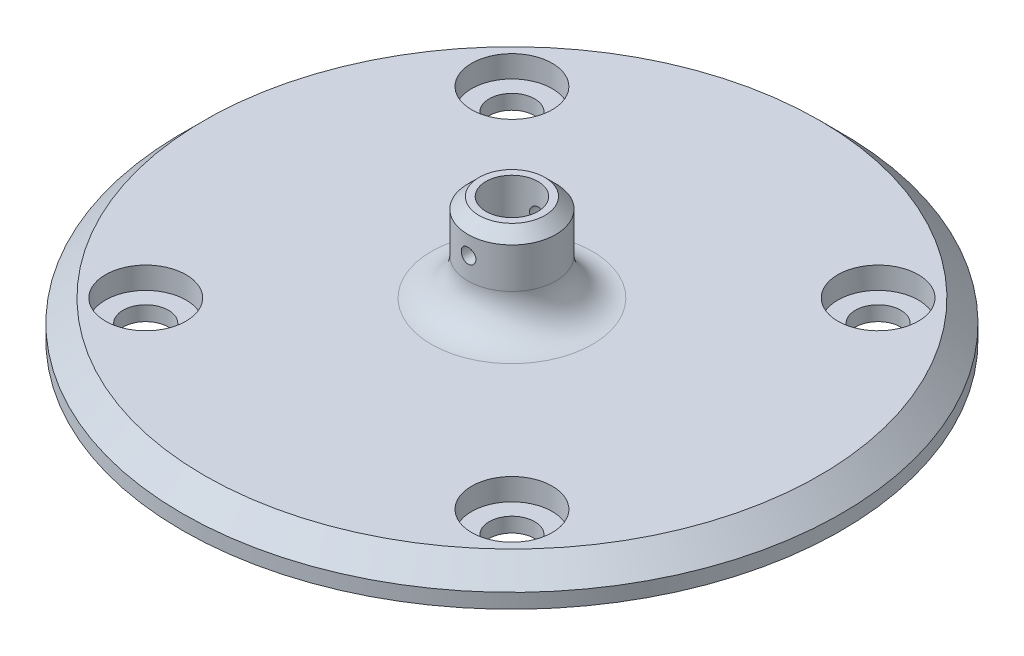
ISO-10303-21;
HEADER;
FILE_DESCRIPTION(('STEP AP214'),'2;1');
FILE_NAME('part.step','',(''),(''),'','','');
FILE_SCHEMA(('AUTOMOTIVE_DESIGN { 1 0 10303 214 1 1 1 1 }'));
ENDSEC;
DATA;
#1=APPLICATION_CONTEXT('core data for automotive mechanical design processes');
#2=APPLICATION_PROTOCOL_DEFINITION('international standard','automotive_design',2000,#1);
#3=PRODUCT_CONTEXT('',#1,'mechanical');
#4=PRODUCT('Part','Part','',(#3));
#5=PRODUCT_RELATED_PRODUCT_CATEGORY('part','',(#4));
#6=PRODUCT_DEFINITION_FORMATION('','',#4);
#7=PRODUCT_DEFINITION_CONTEXT('part definition',#1,'design');
#8=PRODUCT_DEFINITION('design','',#6,#7);
#9=PRODUCT_DEFINITION_SHAPE('','',#8);
#10=(LENGTH_UNIT() NAMED_UNIT(*) SI_UNIT(.MILLI.,.METRE.));
#11=(NAMED_UNIT(*) PLANE_ANGLE_UNIT() SI_UNIT($,.RADIAN.));
#12=(NAMED_UNIT(*) SI_UNIT($,.STERADIAN.) SOLID_ANGLE_UNIT());
#13=UNCERTAINTY_MEASURE_WITH_UNIT(LENGTH_MEASURE(1.E-05),#10,'distance_accuracy_value','');
#14=(GEOMETRIC_REPRESENTATION_CONTEXT(3) GLOBAL_UNCERTAINTY_ASSIGNED_CONTEXT((#13)) GLOBAL_UNIT_ASSIGNED_CONTEXT((#10,
#11,#12)) REPRESENTATION_CONTEXT('',''));
#15=CARTESIAN_POINT('',(0.,0.,0.));
#16=DIRECTION('',(0.,0.,1.));
#17=DIRECTION('',(1.,0.,0.));
#18=AXIS2_PLACEMENT_3D('',#15,#16,#17);
#19=CARTESIAN_POINT('',(-25.0000000000003,0.,24.9999999999997));
#20=DIRECTION('',(0.,1.,0.));
#21=DIRECTION('',(0.,0.,1.));
#22=AXIS2_PLACEMENT_3D('',#19,#20,#21);
#23=CYLINDRICAL_SURFACE('',#22,3.1);
#24=CARTESIAN_POINT('',(-25.0000000000003,0.,24.9999999999997));
#25=DIRECTION('',(0.,1.,0.));
#26=DIRECTION('',(1.,0.,0.));
#27=AXIS2_PLACEMENT_3D('',#24,#25,#26);
#28=CIRCLE('',#27,3.1);
#29=CARTESIAN_POINT('',(-21.9000000000003,0.,24.9999999999998));
#30=VERTEX_POINT('',#29);
#31=EDGE_CURVE('E220',#30,#30,#28,.T.);
#32=ORIENTED_EDGE('',*,*,#31,.F.);
#33=EDGE_LOOP('',(#32));
#34=FACE_BOUND('',#33,.T.);
#35=CARTESIAN_POINT('',(-25.0000000000003,2.,24.9999999999997));
#36=DIRECTION('',(0.,1.,0.));
#37=DIRECTION('',(0.,0.,1.));
#38=AXIS2_PLACEMENT_3D('',#35,#36,#37);
#39=CIRCLE('',#38,3.1);
#40=CARTESIAN_POINT('',(-25.0000000000003,2.,28.0999999999997));
#41=VERTEX_POINT('',#40);
#42=EDGE_CURVE('E239',#41,#41,#39,.F.);
#43=ORIENTED_EDGE('',*,*,#42,.F.);
#44=EDGE_LOOP('',(#43));
#45=FACE_BOUND('',#44,.T.);
#46=ADVANCED_FACE('F45',(#34,#45),#23,.F.);
#47=CARTESIAN_POINT('',(25.,0.,25.));
#48=DIRECTION('',(0.,1.,0.));
#49=DIRECTION('',(0.,0.,1.));
#50=AXIS2_PLACEMENT_3D('',#47,#48,#49);
#51=CYLINDRICAL_SURFACE('',#50,3.1);
#52=CARTESIAN_POINT('',(25.,0.,25.));
#53=DIRECTION('',(0.,1.,0.));
#54=DIRECTION('',(0.,0.,-1.));
#55=AXIS2_PLACEMENT_3D('',#52,#53,#54);
#56=CIRCLE('',#55,3.1);
#57=CARTESIAN_POINT('',(25.,0.,21.9));
#58=VERTEX_POINT('',#57);
#59=EDGE_CURVE('E217',#58,#58,#56,.T.);
#60=ORIENTED_EDGE('',*,*,#59,.F.);
#61=EDGE_LOOP('',(#60));
#62=FACE_BOUND('',#61,.T.);
#63=CARTESIAN_POINT('',(25.,2.,25.));
#64=DIRECTION('',(0.,1.,0.));
#65=DIRECTION('',(0.,0.,1.));
#66=AXIS2_PLACEMENT_3D('',#63,#64,#65);
#67=CIRCLE('',#66,3.1);
#68=CARTESIAN_POINT('',(25.,2.,28.1));
#69=VERTEX_POINT('',#68);
#70=EDGE_CURVE('E235',#69,#69,#67,.F.);
#71=ORIENTED_EDGE('',*,*,#70,.F.);
#72=EDGE_LOOP('',(#71));
#73=FACE_BOUND('',#72,.T.);
#74=ADVANCED_FACE('F143',(#62,#73),#51,.F.);
#75=CARTESIAN_POINT('',(25.0000000000001,0.,-24.9999999999999));
#76=DIRECTION('',(0.,1.,0.));
#77=DIRECTION('',(0.,0.,1.));
#78=AXIS2_PLACEMENT_3D('',#75,#76,#77);
#79=CYLINDRICAL_SURFACE('',#78,3.1);
#80=CARTESIAN_POINT('',(25.0000000000001,0.,-24.9999999999999));
#81=DIRECTION('',(0.,1.,0.));
#82=DIRECTION('',(-1.,0.,0.));
#83=AXIS2_PLACEMENT_3D('',#80,#81,#82);
#84=CIRCLE('',#83,3.1);
#85=CARTESIAN_POINT('',(21.9000000000001,0.,-24.9999999999999));
#86=VERTEX_POINT('',#85);
#87=EDGE_CURVE('E211',#86,#86,#84,.T.);
#88=ORIENTED_EDGE('',*,*,#87,.F.);
#89=EDGE_LOOP('',(#88));
#90=FACE_BOUND('',#89,.T.);
#91=CARTESIAN_POINT('',(25.0000000000001,2.,-24.9999999999999));
#92=DIRECTION('',(0.,1.,0.));
#93=DIRECTION('',(0.,0.,1.));
#94=AXIS2_PLACEMENT_3D('',#91,#92,#93);
#95=CIRCLE('',#94,3.1);
#96=CARTESIAN_POINT('',(25.0000000000001,2.,-21.8999999999999));
#97=VERTEX_POINT('',#96);
#98=EDGE_CURVE('E232',#97,#97,#95,.F.);
#99=ORIENTED_EDGE('',*,*,#98,.F.);
#100=EDGE_LOOP('',(#99));
#101=FACE_BOUND('',#100,.T.);
#102=ADVANCED_FACE('F139',(#90,#101),#79,.F.);
#103=CARTESIAN_POINT('',(-25.,0.,-25.));
#104=DIRECTION('',(0.,1.,0.));
#105=DIRECTION('',(0.,0.,1.));
#106=AXIS2_PLACEMENT_3D('',#103,#104,#105);
#107=CYLINDRICAL_SURFACE('',#106,3.1);
#108=CARTESIAN_POINT('',(-25.,0.,-25.));
#109=DIRECTION('',(0.,1.,0.));
#110=DIRECTION('',(0.,0.,1.));
#111=AXIS2_PLACEMENT_3D('',#108,#109,#110);
#112=CIRCLE('',#111,3.1);
#113=CARTESIAN_POINT('',(-25.,0.,-21.9));
#114=VERTEX_POINT('',#113);
#115=EDGE_CURVE('E223',#114,#114,#112,.T.);
#116=ORIENTED_EDGE('',*,*,#115,.F.);
#117=EDGE_LOOP('',(#116));
#118=FACE_BOUND('',#117,.T.);
#119=CARTESIAN_POINT('',(-25.,2.,-25.));
#120=DIRECTION('',(0.,1.,0.));
#121=DIRECTION('',(0.,0.,1.));
#122=AXIS2_PLACEMENT_3D('',#119,#120,#121);
#123=CIRCLE('',#122,3.1);
#124=CARTESIAN_POINT('',(-25.,2.,-21.9));
#125=VERTEX_POINT('',#124);
#126=EDGE_CURVE('E214',#125,#125,#123,.F.);
#127=ORIENTED_EDGE('',*,*,#126,.F.);
#128=EDGE_LOOP('',(#127));
#129=FACE_BOUND('',#128,.T.);
#130=ADVANCED_FACE('F142',(#118,#129),#107,.F.);
#131=CARTESIAN_POINT('',(0.,5.,0.));
#132=DIRECTION('',(0.,-1.,0.));
#133=DIRECTION('',(0.,0.,-1.));
#134=AXIS2_PLACEMENT_3D('',#131,#132,#133);
#135=CYLINDRICAL_SURFACE('',#134,45.);
#136=CARTESIAN_POINT('',(0.,2.00000000000001,0.));
#137=DIRECTION('',(0.,1.,0.));
#138=DIRECTION('',(0.,0.,1.));
#139=AXIS2_PLACEMENT_3D('',#136,#137,#138);
#140=CIRCLE('',#139,45.);
#141=CARTESIAN_POINT('',(0.,2.00000000000001,45.));
#142=VERTEX_POINT('',#141);
#143=EDGE_CURVE('E57',#142,#142,#140,.F.);
#144=ORIENTED_EDGE('',*,*,#143,.T.);
#145=EDGE_LOOP('',(#144));
#146=FACE_BOUND('',#145,.T.);
#147=CARTESIAN_POINT('',(0.,0.,0.));
#148=DIRECTION('',(0.,1.,0.));
#149=DIRECTION('',(0.,0.,1.));
#150=AXIS2_PLACEMENT_3D('',#147,#148,#149);
#151=CIRCLE('',#150,45.);
#152=CARTESIAN_POINT('',(0.,0.,45.));
#153=VERTEX_POINT('',#152);
#154=EDGE_CURVE('E226',#153,#153,#151,.T.);
#155=ORIENTED_EDGE('',*,*,#154,.T.);
#156=EDGE_LOOP('',(#155));
#157=FACE_BOUND('',#156,.T.);
#158=ADVANCED_FACE('F161',(#146,#157),#135,.T.);
#159=CARTESIAN_POINT('',(0.,5.,0.));
#160=DIRECTION('',(0.,1.,0.));
#161=DIRECTION('',(0.,0.,1.));
#162=AXIS2_PLACEMENT_3D('',#159,#160,#161);
#163=PLANE('',#162);
#164=CARTESIAN_POINT('',(0.,5.,0.));
#165=DIRECTION('',(0.,1.,0.));
#166=DIRECTION('',(0.,0.,1.));
#167=AXIS2_PLACEMENT_3D('',#164,#165,#166);
#168=CIRCLE('',#167,42.);
#169=CARTESIAN_POINT('',(0.,5.,42.));
#170=VERTEX_POINT('',#169);
#171=EDGE_CURVE('E61',#170,#170,#168,.T.);
#172=ORIENTED_EDGE('',*,*,#171,.T.);
#173=EDGE_LOOP('',(#172));
#174=FACE_BOUND('',#173,.T.);
#175=CARTESIAN_POINT('',(0.,5.,0.));
#176=DIRECTION('',(0.,1.,0.));
#177=DIRECTION('',(0.,0.,1.));
#178=AXIS2_PLACEMENT_3D('',#175,#176,#177);
#179=CIRCLE('',#178,11.);
#180=CARTESIAN_POINT('',(0.,5.,11.));
#181=VERTEX_POINT('',#180);
#182=EDGE_CURVE('E66',#181,#181,#179,.F.);
#183=ORIENTED_EDGE('',*,*,#182,.T.);
#184=EDGE_LOOP('',(#183));
#185=FACE_BOUND('',#184,.T.);
#186=CARTESIAN_POINT('',(25.0000000000001,5.,-24.9999999999999));
#187=DIRECTION('',(0.,1.,0.));
#188=DIRECTION('',(-1.,0.,0.));
#189=AXIS2_PLACEMENT_3D('',#186,#187,#188);
#190=CIRCLE('',#189,5.5);
#191=CARTESIAN_POINT('',(19.5000000000001,5.,-24.9999999999999));
#192=VERTEX_POINT('',#191);
#193=EDGE_CURVE('E197',#192,#192,#190,.T.);
#194=ORIENTED_EDGE('',*,*,#193,.F.);
#195=EDGE_LOOP('',(#194));
#196=FACE_BOUND('',#195,.T.);
#197=CARTESIAN_POINT('',(25.,5.,25.));
#198=DIRECTION('',(0.,1.,0.));
#199=DIRECTION('',(0.,0.,-1.));
#200=AXIS2_PLACEMENT_3D('',#197,#198,#199);
#201=CIRCLE('',#200,5.5);
#202=CARTESIAN_POINT('',(25.,5.,19.5));
#203=VERTEX_POINT('',#202);
#204=EDGE_CURVE('E201',#203,#203,#201,.T.);
#205=ORIENTED_EDGE('',*,*,#204,.F.);
#206=EDGE_LOOP('',(#205));
#207=FACE_BOUND('',#206,.T.);
#208=CARTESIAN_POINT('',(-25.0000000000003,5.,24.9999999999997));
#209=DIRECTION('',(0.,1.,0.));
#210=DIRECTION('',(1.,0.,0.));
#211=AXIS2_PLACEMENT_3D('',#208,#209,#210);
#212=CIRCLE('',#211,5.5);
#213=CARTESIAN_POINT('',(-19.5000000000003,5.,24.9999999999998));
#214=VERTEX_POINT('',#213);
#215=EDGE_CURVE('E205',#214,#214,#212,.T.);
#216=ORIENTED_EDGE('',*,*,#215,.F.);
#217=EDGE_LOOP('',(#216));
#218=FACE_BOUND('',#217,.T.);
#219=CARTESIAN_POINT('',(-25.,5.,-25.));
#220=DIRECTION('',(0.,1.,0.));
#221=DIRECTION('',(0.,0.,1.));
#222=AXIS2_PLACEMENT_3D('',#219,#220,#221);
#223=CIRCLE('',#222,5.5);
#224=CARTESIAN_POINT('',(-25.,5.,-19.5));
#225=VERTEX_POINT('',#224);
#226=EDGE_CURVE('E208',#225,#225,#223,.T.);
#227=ORIENTED_EDGE('',*,*,#226,.F.);
#228=EDGE_LOOP('',(#227));
#229=FACE_BOUND('',#228,.T.);
#230=ADVANCED_FACE('F163',(#174,#185,#196,#207,#218,#229),#163,.T.);
#231=CARTESIAN_POINT('',(0.,0.,0.));
#232=DIRECTION('',(0.,1.,0.));
#233=DIRECTION('',(0.,0.,1.));
#234=AXIS2_PLACEMENT_3D('',#231,#232,#233);
#235=PLANE('',#234);
#236=CARTESIAN_POINT('',(0.,0.,0.));
#237=DIRECTION('',(0.,1.,0.));
#238=DIRECTION('',(0.,0.,1.));
#239=AXIS2_PLACEMENT_3D('',#236,#237,#238);
#240=CIRCLE('',#239,3.05);
#241=CARTESIAN_POINT('',(0.,0.,3.05));
#242=VERTEX_POINT('',#241);
#243=EDGE_CURVE('E272',#242,#242,#240,.T.);
#244=ORIENTED_EDGE('',*,*,#243,.T.);
#245=EDGE_LOOP('',(#244));
#246=FACE_BOUND('',#245,.T.);
#247=ORIENTED_EDGE('',*,*,#87,.T.);
#248=EDGE_LOOP('',(#247));
#249=FACE_BOUND('',#248,.T.);
#250=ORIENTED_EDGE('',*,*,#59,.T.);
#251=EDGE_LOOP('',(#250));
#252=FACE_BOUND('',#251,.T.);
#253=ORIENTED_EDGE('',*,*,#31,.T.);
#254=EDGE_LOOP('',(#253));
#255=FACE_BOUND('',#254,.T.);
#256=ORIENTED_EDGE('',*,*,#115,.T.);
#257=EDGE_LOOP('',(#256));
#258=FACE_BOUND('',#257,.T.);
#259=ORIENTED_EDGE('',*,*,#154,.F.);
#260=EDGE_LOOP('',(#259));
#261=FACE_BOUND('',#260,.T.);
#262=ADVANCED_FACE('F154',(#246,#249,#252,#255,#258,#261),#235,.F.);
#263=CARTESIAN_POINT('',(0.,2.,0.));
#264=DIRECTION('',(0.,1.,0.));
#265=DIRECTION('',(0.,0.,1.));
#266=AXIS2_PLACEMENT_3D('',#263,#264,#265);
#267=PLANE('',#266);
#268=CARTESIAN_POINT('',(-25.,2.,-25.));
#269=DIRECTION('',(0.,1.,0.));
#270=DIRECTION('',(0.,0.,1.));
#271=AXIS2_PLACEMENT_3D('',#268,#269,#270);
#272=CIRCLE('',#271,5.5);
#273=CARTESIAN_POINT('',(-25.,2.,-19.5));
#274=VERTEX_POINT('',#273);
#275=EDGE_CURVE('E210',#274,#274,#272,.F.);
#276=ORIENTED_EDGE('',*,*,#275,.F.);
#277=EDGE_LOOP('',(#276));
#278=FACE_BOUND('',#277,.T.);
#279=ORIENTED_EDGE('',*,*,#126,.T.);
#280=EDGE_LOOP('',(#279));
#281=FACE_BOUND('',#280,.T.);
#282=ADVANCED_FACE('F151',(#278,#281),#267,.T.);
#283=CARTESIAN_POINT('',(-25.,-15.556349186104,-25.));
#284=DIRECTION('',(0.,1.,0.));
#285=DIRECTION('',(0.,0.,1.));
#286=AXIS2_PLACEMENT_3D('',#283,#284,#285);
#287=CYLINDRICAL_SURFACE('',#286,5.5);
#288=ORIENTED_EDGE('',*,*,#275,.T.);
#289=EDGE_LOOP('',(#288));
#290=FACE_BOUND('',#289,.T.);
#291=ORIENTED_EDGE('',*,*,#226,.T.);
#292=EDGE_LOOP('',(#291));
#293=FACE_BOUND('',#292,.T.);
#294=ADVANCED_FACE('F119',(#290,#293),#287,.F.);
#295=CARTESIAN_POINT('',(0.,2.,0.));
#296=DIRECTION('',(0.,1.,0.));
#297=DIRECTION('',(0.,0.,1.));
#298=AXIS2_PLACEMENT_3D('',#295,#296,#297);
#299=PLANE('',#298);
#300=CARTESIAN_POINT('',(25.0000000000001,2.,-24.9999999999999));
#301=DIRECTION('',(0.,1.,0.));
#302=DIRECTION('',(0.,0.,1.));
#303=AXIS2_PLACEMENT_3D('',#300,#301,#302);
#304=CIRCLE('',#303,5.5);
#305=CARTESIAN_POINT('',(25.0000000000001,2.,-19.4999999999999));
#306=VERTEX_POINT('',#305);
#307=EDGE_CURVE('E236',#306,#306,#304,.F.);
#308=ORIENTED_EDGE('',*,*,#307,.F.);
#309=EDGE_LOOP('',(#308));
#310=FACE_BOUND('',#309,.T.);
#311=ORIENTED_EDGE('',*,*,#98,.T.);
#312=EDGE_LOOP('',(#311));
#313=FACE_BOUND('',#312,.T.);
#314=ADVANCED_FACE('F114',(#310,#313),#299,.T.);
#315=CARTESIAN_POINT('',(25.0000000000001,-15.556349186104,-24.9999999999999));
#316=DIRECTION('',(0.,1.,0.));
#317=DIRECTION('',(0.,0.,1.));
#318=AXIS2_PLACEMENT_3D('',#315,#316,#317);
#319=CYLINDRICAL_SURFACE('',#318,5.5);
#320=ORIENTED_EDGE('',*,*,#307,.T.);
#321=EDGE_LOOP('',(#320));
#322=FACE_BOUND('',#321,.T.);
#323=ORIENTED_EDGE('',*,*,#193,.T.);
#324=EDGE_LOOP('',(#323));
#325=FACE_BOUND('',#324,.T.);
#326=ADVANCED_FACE('F118',(#322,#325),#319,.F.);
#327=CARTESIAN_POINT('',(0.,2.,0.));
#328=DIRECTION('',(0.,1.,0.));
#329=DIRECTION('',(0.,0.,1.));
#330=AXIS2_PLACEMENT_3D('',#327,#328,#329);
#331=PLANE('',#330);
#332=CARTESIAN_POINT('',(25.,2.,25.));
#333=DIRECTION('',(0.,1.,0.));
#334=DIRECTION('',(0.,0.,1.));
#335=AXIS2_PLACEMENT_3D('',#332,#333,#334);
#336=CIRCLE('',#335,5.5);
#337=CARTESIAN_POINT('',(25.,2.,30.5));
#338=VERTEX_POINT('',#337);
#339=EDGE_CURVE('E260',#338,#338,#336,.F.);
#340=ORIENTED_EDGE('',*,*,#339,.F.);
#341=EDGE_LOOP('',(#340));
#342=FACE_BOUND('',#341,.T.);
#343=ORIENTED_EDGE('',*,*,#70,.T.);
#344=EDGE_LOOP('',(#343));
#345=FACE_BOUND('',#344,.T.);
#346=ADVANCED_FACE('F123',(#342,#345),#331,.T.);
#347=CARTESIAN_POINT('',(25.,-15.556349186104,25.));
#348=DIRECTION('',(0.,1.,0.));
#349=DIRECTION('',(0.,0.,1.));
#350=AXIS2_PLACEMENT_3D('',#347,#348,#349);
#351=CYLINDRICAL_SURFACE('',#350,5.5);
#352=ORIENTED_EDGE('',*,*,#339,.T.);
#353=EDGE_LOOP('',(#352));
#354=FACE_BOUND('',#353,.T.);
#355=ORIENTED_EDGE('',*,*,#204,.T.);
#356=EDGE_LOOP('',(#355));
#357=FACE_BOUND('',#356,.T.);
#358=ADVANCED_FACE('F127',(#354,#357),#351,.F.);
#359=CARTESIAN_POINT('',(0.,2.,0.));
#360=DIRECTION('',(0.,1.,0.));
#361=DIRECTION('',(0.,0.,1.));
#362=AXIS2_PLACEMENT_3D('',#359,#360,#361);
#363=PLANE('',#362);
#364=CARTESIAN_POINT('',(-25.0000000000003,2.,24.9999999999997));
#365=DIRECTION('',(0.,1.,0.));
#366=DIRECTION('',(0.,0.,1.));
#367=AXIS2_PLACEMENT_3D('',#364,#365,#366);
#368=CIRCLE('',#367,5.5);
#369=CARTESIAN_POINT('',(-25.0000000000003,2.,30.4999999999997));
#370=VERTEX_POINT('',#369);
#371=EDGE_CURVE('E255',#370,#370,#368,.F.);
#372=ORIENTED_EDGE('',*,*,#371,.F.);
#373=EDGE_LOOP('',(#372));
#374=FACE_BOUND('',#373,.T.);
#375=ORIENTED_EDGE('',*,*,#42,.T.);
#376=EDGE_LOOP('',(#375));
#377=FACE_BOUND('',#376,.T.);
#378=ADVANCED_FACE('F131',(#374,#377),#363,.T.);
#379=CARTESIAN_POINT('',(-25.0000000000003,-15.556349186104,24.9999999999997));
#380=DIRECTION('',(0.,1.,0.));
#381=DIRECTION('',(0.,0.,1.));
#382=AXIS2_PLACEMENT_3D('',#379,#380,#381);
#383=CYLINDRICAL_SURFACE('',#382,5.5);
#384=ORIENTED_EDGE('',*,*,#371,.T.);
#385=EDGE_LOOP('',(#384));
#386=FACE_BOUND('',#385,.T.);
#387=ORIENTED_EDGE('',*,*,#215,.T.);
#388=EDGE_LOOP('',(#387));
#389=FACE_BOUND('',#388,.T.);
#390=ADVANCED_FACE('F113',(#386,#389),#383,.F.);
#391=CARTESIAN_POINT('',(0.,17.,0.));
#392=DIRECTION('',(0.,-1.,0.));
#393=DIRECTION('',(0.,0.,-1.));
#394=AXIS2_PLACEMENT_3D('',#391,#392,#393);
#395=CYLINDRICAL_SURFACE('',#394,6.);
#396=CARTESIAN_POINT('',(0.,15.5,0.));
#397=DIRECTION('',(0.,1.,0.));
#398=DIRECTION('',(0.,0.,1.));
#399=AXIS2_PLACEMENT_3D('',#396,#397,#398);
#400=CIRCLE('',#399,6.);
#401=CARTESIAN_POINT('',(0.,15.5,6.));
#402=VERTEX_POINT('',#401);
#403=EDGE_CURVE('E11',#402,#402,#400,.F.);
#404=ORIENTED_EDGE('',*,*,#403,.T.);
#405=EDGE_LOOP('',(#404));
#406=FACE_BOUND('',#405,.T.);
#407=CARTESIAN_POINT('',(0.,14.,-6.));
#408=CARTESIAN_POINT('',(-0.055756361983286,13.9999977644209,-5.9999990446753));
#409=CARTESIAN_POINT('',(-0.111543152735529,13.9953210900124,-5.99921471165214));
#410=CARTESIAN_POINT('',(-0.221552088669217,13.9767457364939,-5.99616137976555));
#411=CARTESIAN_POINT('',(-0.275772747183699,13.9628385772354,-5.99389101569556));
#412=CARTESIAN_POINT('',(-0.381041898885059,13.9262338205629,-5.9881202729458));
#413=CARTESIAN_POINT('',(-0.432092947372761,13.9035434137438,-5.98462090063677));
#414=CARTESIAN_POINT('',(-0.52965673679118,13.850035083179,-5.97677690832828));
#415=CARTESIAN_POINT('',(-0.576169995951438,13.8192180890068,-5.97243238501774));
#416=CARTESIAN_POINT('',(-0.663789045716673,13.7500179664718,-5.96333326983325));
#417=CARTESIAN_POINT('',(-0.704845161413988,13.7115723541456,-5.95857548725943));
#418=CARTESIAN_POINT('',(-0.779955399463972,13.6283408126109,-5.94921050750693));
#419=CARTESIAN_POINT('',(-0.81400907975639,13.5835544834174,-5.94460331985067));
#420=CARTESIAN_POINT('',(-0.874346850242055,13.4885716135212,-5.93603026303912));
#421=CARTESIAN_POINT('',(-0.900581821144403,13.4383434652781,-5.93206851636655));
#422=CARTESIAN_POINT('',(-0.94422334616449,13.3341161742797,-5.9252791591787));
#423=CARTESIAN_POINT('',(-0.961630496626247,13.2801172865289,-5.92245147205723));
#424=CARTESIAN_POINT('',(-0.986965751113924,13.1704078900574,-5.91828214737102));
#425=CARTESIAN_POINT('',(-0.994979611654162,13.1147177053994,-5.9169270739428));
#426=CARTESIAN_POINT('',(-1.00156669011595,13.0027678892466,-5.9158157557466));
#427=CARTESIAN_POINT('',(-1.0001405761556,12.9465082983331,-5.91605939782886));
#428=CARTESIAN_POINT('',(-0.987958039358461,12.8356288554898,-5.91810571545422));
#429=CARTESIAN_POINT('',(-0.97729795275591,12.7809980785819,-5.91989229327567));
#430=CARTESIAN_POINT('',(-0.947101256161378,12.6743114728683,-5.92479798084403));
#431=CARTESIAN_POINT('',(-0.927564341727897,12.6222557324446,-5.92791713629309));
#432=CARTESIAN_POINT('',(-0.880070898437565,12.5219084706236,-5.9351539173364));
#433=CARTESIAN_POINT('',(-0.852074365551886,12.4736362375675,-5.9392762684293));
#434=CARTESIAN_POINT('',(-0.788484807022974,12.3824382397846,-5.94805167366004));
#435=CARTESIAN_POINT('',(-0.752891168261715,12.339512907018,-5.95270477061714));
#436=CARTESIAN_POINT('',(-0.674592884863622,12.2596695656771,-5.96208811151914));
#437=CARTESIAN_POINT('',(-0.631805585549252,12.222832592584,-5.96681859692661));
#438=CARTESIAN_POINT('',(-0.54061409959266,12.1568488949339,-5.97577040558689));
#439=CARTESIAN_POINT('',(-0.49220987676257,12.1277022199267,-5.97999172555898));
#440=CARTESIAN_POINT('',(-0.391082366466685,12.0779191091455,-5.98745557157165));
#441=CARTESIAN_POINT('',(-0.338355490225865,12.0572898322675,-5.99069727362979));
#442=CARTESIAN_POINT('',(-0.230119338241093,12.0252023139016,-5.99583001205064));
#443=CARTESIAN_POINT('',(-0.174610295671788,12.0137433052105,-5.9977211614019));
#444=CARTESIAN_POINT('',(-0.0630839605206497,12.0004314566155,-5.99992451937074));
#445=CARTESIAN_POINT('',(-0.00708029486040454,11.9984673712778,-6.00025501205114));
#446=CARTESIAN_POINT('',(0.104455909155955,12.0039045377712,-5.99934989768468));
#447=CARTESIAN_POINT('',(0.159988465556816,12.0113054292535,-5.99811435089647));
#448=CARTESIAN_POINT('',(0.268662470218706,12.0351699397342,-5.99422730775281));
#449=CARTESIAN_POINT('',(0.321816347354152,12.051578483356,-5.99158441920524));
#450=CARTESIAN_POINT('',(0.424618753944178,12.0929338072798,-5.98517785782144));
#451=CARTESIAN_POINT('',(0.474267086363889,12.1178810670541,-5.98141412204808));
#452=CARTESIAN_POINT('',(0.569132275787585,12.1758604498787,-5.97313806520963));
#453=CARTESIAN_POINT('',(0.61430610037486,12.2089620624669,-5.96861942354809));
#454=CARTESIAN_POINT('',(0.698497434201076,12.282214926154,-5.9593538695676));
#455=CARTESIAN_POINT('',(0.737514495878634,12.3223666893107,-5.95460694068619));
#456=CARTESIAN_POINT('',(0.808697111863202,12.4090790192286,-5.94536070094338));
#457=CARTESIAN_POINT('',(0.840787504445488,12.4557016662058,-5.94086446454842));
#458=CARTESIAN_POINT('',(0.896680924117996,12.5537411876554,-5.93268611911154));
#459=CARTESIAN_POINT('',(0.92048421390793,12.605157910091,-5.92900398426408));
#460=CARTESIAN_POINT('',(0.959015332589261,12.7111158931249,-5.92289381479082));
#461=CARTESIAN_POINT('',(0.973780573019179,12.7656432380122,-5.92046061724426));
#462=CARTESIAN_POINT('',(0.993934181511312,12.8764480516887,-5.91711086734104));
#463=CARTESIAN_POINT('',(0.999323364778468,12.9327253678928,-5.91619418313089));
#464=CARTESIAN_POINT('',(1.00054914641894,13.044682066385,-5.91598693233605));
#465=CARTESIAN_POINT('',(0.996504054450076,13.1003601514301,-5.9166762260226));
#466=CARTESIAN_POINT('',(0.97923193558274,13.2102316992203,-5.91955912581491));
#467=CARTESIAN_POINT('',(0.966004938444992,13.2644251667767,-5.92175272704486));
#468=CARTESIAN_POINT('',(0.930789795837962,13.369743374917,-5.92738942512688));
#469=CARTESIAN_POINT('',(0.908811836240178,13.4208716040224,-5.93083106887868));
#470=CARTESIAN_POINT('',(0.856730801566365,13.5187342676779,-5.93857747568883));
#471=CARTESIAN_POINT('',(0.826627323499427,13.5654684841489,-5.9428822815536));
#472=CARTESIAN_POINT('',(0.758727553748863,13.6538142332431,-5.95193381618249));
#473=CARTESIAN_POINT('',(0.72084422543746,13.6953584066801,-5.95668518230521));
#474=CARTESIAN_POINT('',(0.638643612552093,13.77154064179,-5.96605748944336));
#475=CARTESIAN_POINT('',(0.594324845165055,13.8061771074553,-5.97067840010619));
#476=CARTESIAN_POINT('',(0.500147667856113,13.86777930728,-5.97930611856888));
#477=CARTESIAN_POINT('',(0.450253115013128,13.8946904157252,-5.98330846501242));
#478=CARTESIAN_POINT('',(0.346605227751593,13.939707793844,-5.9902046704071));
#479=CARTESIAN_POINT('',(0.292855797932005,13.9578228324319,-5.99309963270993));
#480=CARTESIAN_POINT('',(0.199081324018161,13.9808021096507,-5.99682316333182));
#481=CARTESIAN_POINT('',(0.15962353211938,13.9879897878464,-5.99800810909344));
#482=CARTESIAN_POINT('',(0.0801157241279242,13.9975894951379,-5.99959686394448));
#483=CARTESIAN_POINT('',(0.0400657182433979,14.0000016064549,-6.00000068648257));
#484=CARTESIAN_POINT('',(0.,14.,-6.));
#485=B_SPLINE_CURVE_WITH_KNOTS('',3,(#407,#408,#409,#410,#411,#412,#413,#414,#415,#416,#417,
#418,#419,#420,#421,#422,#423,#424,#425,#426,#427,#428,#429,#430,#431,#432,#433,#434,#435,#436,
#437,#438,#439,#440,#441,#442,#443,#444,#445,#446,#447,#448,#449,#450,#451,#452,#453,#454,#455,
#456,#457,#458,#459,#460,#461,#462,#463,#464,#465,#466,#467,#468,#469,#470,#471,#472,#473,#474,
#475,#476,#477,#478,#479,#480,#481,#482,#483,#484),.UNSPECIFIED.,.T.,.F.,(4,2,2,2,2,2,2,2,2,2,2,
2,2,2,2,2,2,2,2,2,2,2,2,2,2,2,2,2,2,2,2,2,2,2,2,2,2,2,4),(0.,0.167122633975404,
0.334399018278169,0.50153874681011,0.668659365069918,0.837209964249329,1.00577120067943,
1.17537008329536,1.34495750750473,1.5129843084137,1.68099921728355,1.84728208704164,
2.01357066010153,2.18065822653023,2.3477592827223,2.51693107964531,2.68610396654339,
2.85541875566361,3.0247193780846,3.19203153396559,3.35933725214344,3.52563122802567,
3.69193454330427,3.8597073025081,4.02749225221714,4.19701528803048,4.36653294950378,
4.53534408936709,4.70414055114647,4.8708316380908,5.03752218475253,5.20401927290489,
5.37052462011735,5.53900553677357,5.7075253355159,5.87720892642881,6.04672300852029,
6.16681699265608,6.28690890910788),.UNSPECIFIED.);
#486=CARTESIAN_POINT('',(0.,14.,-6.));
#487=VERTEX_POINT('',#486);
#488=EDGE_CURVE('E103',#487,#487,#485,.T.);
#489=ORIENTED_EDGE('',*,*,#488,.T.);
#490=EDGE_LOOP('',(#489));
#491=FACE_BOUND('',#490,.T.);
#492=CARTESIAN_POINT('',(-1.,13.,5.91607978309962));
#493=CARTESIAN_POINT('',(-0.999997759368403,13.0557502992584,5.91608078960511));
#494=CARTESIAN_POINT('',(-0.995322067614929,13.1115310424099,5.91687637019227));
#495=CARTESIAN_POINT('',(-0.976750971230158,13.2215274172881,5.91996982947271));
#496=CARTESIAN_POINT('',(-0.962847064123862,13.2757415574998,5.92226909356571));
#497=CARTESIAN_POINT('',(-0.926251817466857,13.3809969133427,5.9281024372893));
#498=CARTESIAN_POINT('',(-0.903567821972436,13.4320407394665,5.9316354846878));
#499=CARTESIAN_POINT('',(-0.850074598756147,13.5295923818855,5.93953708845736));
#500=CARTESIAN_POINT('',(-0.819266285400628,13.5761007078305,5.94390555078989));
#501=CARTESIAN_POINT('',(-0.75007501078652,13.6637251398983,5.95303388461044));
#502=CARTESIAN_POINT('',(-0.711627619572909,13.7047900525546,5.95779686930827));
#503=CARTESIAN_POINT('',(-0.628388801878136,13.7799173227446,5.96714992267783));
#504=CARTESIAN_POINT('',(-0.583596999659995,13.8139792652461,5.97173998108788));
#505=CARTESIAN_POINT('',(-0.488609147979335,13.8743258268877,5.98026294792988));
#506=CARTESIAN_POINT('',(-0.438382432582681,13.9005628030927,5.98419176972911));
#507=CARTESIAN_POINT('',(-0.334158248689548,13.9442084282122,5.99091494782862));
#508=CARTESIAN_POINT('',(-0.280161025631275,13.961617651154,5.9937093778907));
#509=CARTESIAN_POINT('',(-0.170457490537695,13.9869570139936,5.99782693889752));
#510=CARTESIAN_POINT('',(-0.114771554671707,13.9949731664019,5.99916341244362));
#511=CARTESIAN_POINT('',(-0.00283011421031778,14.001566301661,6.00026031737113));
#512=CARTESIAN_POINT('',(0.0534253514115606,14.0001439260989,6.00002085587723));
#513=CARTESIAN_POINT('',(0.164320874031552,13.9879674593887,5.99800343372556));
#514=CARTESIAN_POINT('',(0.218971412280058,13.9773059346363,5.99624073476959));
#515=CARTESIAN_POINT('',(0.325696791844718,13.9470995703014,5.99139191508655));
#516=CARTESIAN_POINT('',(0.377771554660603,13.9275544601642,5.98830575405285));
#517=CARTESIAN_POINT('',(0.47814245911306,13.8800437438739,5.98113079404783));
#518=CARTESIAN_POINT('',(0.526420209207618,13.852039995167,5.97703746930752));
#519=CARTESIAN_POINT('',(0.617626211938657,13.788434870946,5.96830295228599));
#520=CARTESIAN_POINT('',(0.660554031166351,13.7528328805157,5.96366171567654));
#521=CARTESIAN_POINT('',(0.740388509378667,13.6745284773523,5.95428107293039));
#522=CARTESIAN_POINT('',(0.777215800901283,13.6317451620396,5.94954115892417));
#523=CARTESIAN_POINT('',(0.843181835379226,13.5405651639137,5.94055183913922));
#524=CARTESIAN_POINT('',(0.872320507412967,13.4921684293269,5.9363024378853));
#525=CARTESIAN_POINT('',(0.922097773795315,13.391043343249,5.92877501824727));
#526=CARTESIAN_POINT('',(0.942726810911698,13.3383102007632,5.92549809321041));
#527=CARTESIAN_POINT('',(0.974811948326248,13.230060371077,5.92030475475952));
#528=CARTESIAN_POINT('',(0.986268856307183,13.174543929427,5.91838822155329));
#529=CARTESIAN_POINT('',(0.999572753951707,13.0630135375351,5.91615583768847));
#530=CARTESIAN_POINT('',(1.00153288316498,13.0070134481192,5.91582114303468));
#531=CARTESIAN_POINT('',(0.996089081072984,12.8954853313237,5.91674013912944));
#532=CARTESIAN_POINT('',(0.988685511449867,12.8399572857944,5.91799376852741));
#533=CARTESIAN_POINT('',(0.96482093397124,12.7313088963237,5.92193074982007));
#534=CARTESIAN_POINT('',(0.948417516258555,12.6781755440488,5.92460500767339));
#535=CARTESIAN_POINT('',(0.907079276076911,12.5754119334882,5.93107429202201));
#536=CARTESIAN_POINT('',(0.882143943240374,12.5257818849796,5.93486938556232));
#537=CARTESIAN_POINT('',(0.824182669291691,12.4309301622376,5.94319651358957));
#538=CARTESIAN_POINT('',(0.791084225663745,12.3857533708976,5.94773502240139));
#539=CARTESIAN_POINT('',(0.717835786283191,12.301554586922,5.95701866671947));
#540=CARTESIAN_POINT('',(0.677685294553616,12.2625330275561,5.96176381674132));
#541=CARTESIAN_POINT('',(0.590971228131522,12.1913392429085,5.97098568847306));
#542=CARTESIAN_POINT('',(0.544345301354478,12.1592424694862,5.97545910537869));
#543=CARTESIAN_POINT('',(0.44629737917973,12.103337869198,5.98358044973177));
#544=CARTESIAN_POINT('',(0.39487553898825,12.0795297742105,5.9872284038799));
#545=CARTESIAN_POINT('',(0.28891962060053,12.0409957664181,5.99327343267833));
#546=CARTESIAN_POINT('',(0.234400225041043,12.026230369706,5.99567593827049));
#547=CARTESIAN_POINT('',(0.123612293949684,12.0060737604145,5.99898233267713));
#548=CARTESIAN_POINT('',(0.0673439027286485,12.0006817765071,5.99988634480071));
#549=CARTESIAN_POINT('',(-0.0446165103094731,11.9994472470751,6.0000921515513));
#550=CARTESIAN_POINT('',(-0.100307264241072,12.0034898984236,5.99941320809696));
#551=CARTESIAN_POINT('',(-0.210204789725877,12.0207615689078,5.99656871354913));
#552=CARTESIAN_POINT('',(-0.26441156958697,12.0339905366038,5.99440317078001));
#553=CARTESIAN_POINT('',(-0.369758578367437,12.0692152662175,5.98882795531034));
#554=CARTESIAN_POINT('',(-0.420902148861609,12.0912012672842,5.98541966816622));
#555=CARTESIAN_POINT('',(-0.518792181192786,12.1433031744921,5.97773102750941));
#556=CARTESIAN_POINT('',(-0.565538434446986,12.1734194660244,5.97345063265953));
#557=CARTESIAN_POINT('',(-0.653885178210863,12.2413340369848,5.96443051847589));
#558=CARTESIAN_POINT('',(-0.695420572242245,12.2792163819027,5.95968609820294));
#559=CARTESIAN_POINT('',(-0.771585550379217,12.3614113231593,5.95030521321901));
#560=CARTESIAN_POINT('',(-0.806213514680476,12.4057254235566,5.94566877405441));
#561=CARTESIAN_POINT('',(-0.867805708367845,12.4998981290031,5.93699337428039));
#562=CARTESIAN_POINT('',(-0.894713995637816,12.5497937359352,5.93295887192494));
#563=CARTESIAN_POINT('',(-0.939725814576365,12.6534436943646,5.92599684088708));
#564=CARTESIAN_POINT('',(-0.957838142092641,12.7071941290788,5.92306820700509));
#565=CARTESIAN_POINT('',(-0.980810421248858,12.8009615077907,5.91929897935112));
#566=CARTESIAN_POINT('',(-0.987994967068112,12.8404107231834,5.91809849368407));
#567=CARTESIAN_POINT('',(-0.997590518072969,12.9199013939364,5.91648854114608));
#568=CARTESIAN_POINT('',(-1.00000160991677,12.9599428385321,5.91607905991511));
#569=CARTESIAN_POINT('',(-1.,13.,5.91607978309962));
#570=B_SPLINE_CURVE_WITH_KNOTS('',3,(#492,#493,#494,#495,#496,#497,#498,#499,#500,#501,#502,
#503,#504,#505,#506,#507,#508,#509,#510,#511,#512,#513,#514,#515,#516,#517,#518,#519,#520,#521,
#522,#523,#524,#525,#526,#527,#528,#529,#530,#531,#532,#533,#534,#535,#536,#537,#538,#539,#540,
#541,#542,#543,#544,#545,#546,#547,#548,#549,#550,#551,#552,#553,#554,#555,#556,#557,#558,#559,
#560,#561,#562,#563,#564,#565,#566,#567,#568,#569),.UNSPECIFIED.,.T.,.F.,(4,2,2,2,2,2,2,2,2,2,2,
2,2,2,2,2,2,2,2,2,2,2,2,2,2,2,2,2,2,2,2,2,2,2,2,2,2,2,4),(0.,0.167104415562126,0.33436300796778,
0.501481999132667,0.668582189603689,0.837156636605451,1.00574107132038,1.17533192042833,
1.34491174042705,1.51292626987286,1.68092937859336,1.84726848464127,2.01361265698073,
2.18071841654029,2.34783770488965,2.51698449383109,2.68613284296667,2.85547064997701,
3.0247935437349,3.19209416966424,3.3593883336385,3.52562425852456,3.69187012915689,
3.8596493710334,4.02744041770536,4.19697645212412,4.36650700188939,4.53529193765318,
4.704062983632,4.87079110504626,5.03751829285789,5.20406015931242,5.37060992155194,
5.53906798983561,5.70756551550984,5.87725491045141,6.04677426695051,6.16684268214776,
6.28690891757997),.UNSPECIFIED.);
#571=CARTESIAN_POINT('',(-1.,13.,5.91607978309962));
#572=VERTEX_POINT('',#571);
#573=EDGE_CURVE('E75',#572,#572,#570,.T.);
#574=ORIENTED_EDGE('',*,*,#573,.T.);
#575=EDGE_LOOP('',(#574));
#576=FACE_BOUND('',#575,.T.);
#577=CARTESIAN_POINT('',(0.,10.,0.));
#578=DIRECTION('',(0.,1.,0.));
#579=DIRECTION('',(0.,0.,1.));
#580=AXIS2_PLACEMENT_3D('',#577,#578,#579);
#581=CIRCLE('',#580,6.);
#582=CARTESIAN_POINT('',(0.,10.,6.));
#583=VERTEX_POINT('',#582);
#584=EDGE_CURVE('E229',#583,#583,#581,.T.);
#585=ORIENTED_EDGE('',*,*,#584,.T.);
#586=EDGE_LOOP('',(#585));
#587=FACE_BOUND('',#586,.T.);
#588=ADVANCED_FACE('F108',(#406,#491,#576,#587),#395,.T.);
#589=CARTESIAN_POINT('',(0.,17.,0.));
#590=DIRECTION('',(0.,1.,0.));
#591=DIRECTION('',(0.,0.,1.));
#592=AXIS2_PLACEMENT_3D('',#589,#590,#591);
#593=PLANE('',#592);
#594=CARTESIAN_POINT('',(0.,17.,0.));
#595=DIRECTION('',(0.,1.,0.));
#596=DIRECTION('',(0.,0.,1.));
#597=AXIS2_PLACEMENT_3D('',#594,#595,#596);
#598=CIRCLE('',#597,4.50000000000002);
#599=CARTESIAN_POINT('',(0.,17.,4.50000000000002));
#600=VERTEX_POINT('',#599);
#601=EDGE_CURVE('E53',#600,#600,#598,.T.);
#602=ORIENTED_EDGE('',*,*,#601,.T.);
#603=EDGE_LOOP('',(#602));
#604=FACE_BOUND('',#603,.T.);
#605=CARTESIAN_POINT('',(0.,17.,0.));
#606=DIRECTION('',(0.,1.,0.));
#607=DIRECTION('',(0.,0.,1.));
#608=AXIS2_PLACEMENT_3D('',#605,#606,#607);
#609=CIRCLE('',#608,3.55);
#610=CARTESIAN_POINT('',(0.,17.,3.55));
#611=VERTEX_POINT('',#610);
#612=EDGE_CURVE('E269',#611,#611,#609,.T.);
#613=ORIENTED_EDGE('',*,*,#612,.F.);
#614=EDGE_LOOP('',(#613));
#615=FACE_BOUND('',#614,.T.);
#616=ADVANCED_FACE('F112',(#604,#615),#593,.T.);
#617=CARTESIAN_POINT('',(0.,-10.040916292849,0.));
#618=DIRECTION('',(0.,1.,0.));
#619=DIRECTION('',(0.,0.,1.));
#620=AXIS2_PLACEMENT_3D('',#617,#618,#619);
#621=CYLINDRICAL_SURFACE('',#620,3.55);
#622=CARTESIAN_POINT('',(0.,12.,3.55));
#623=CARTESIAN_POINT('',(0.0550098726049214,12.0000010474194,3.54999930314918));
#624=CARTESIAN_POINT('',(0.110030598649628,12.0045542816449,3.54870894345243));
#625=CARTESIAN_POINT('',(0.218479449301558,12.0226099040419,3.54368706580898));
#626=CARTESIAN_POINT('',(0.271906927017668,12.0361158768704,3.53995457004412));
#627=CARTESIAN_POINT('',(0.375588762381836,12.0715973222219,3.53045909054309));
#628=CARTESIAN_POINT('',(0.425847363161445,12.0935611767618,3.5246988930426));
#629=CARTESIAN_POINT('',(0.521968112208625,12.1452898162229,3.51175233079619));
#630=CARTESIAN_POINT('',(0.567829835217725,12.175055354672,3.50456582830646));
#631=CARTESIAN_POINT('',(0.655030050791464,12.2423470118291,3.48933257095888));
#632=CARTESIAN_POINT('',(0.696239879370594,12.2800362330891,3.48126980253637));
#633=CARTESIAN_POINT('',(0.771845593568295,12.3617572125436,3.46529230007533));
#634=CARTESIAN_POINT('',(0.806240490029477,12.4057898898631,3.45737758767722));
#635=CARTESIAN_POINT('',(0.867888868400989,12.5000017082321,3.44242613343115));
#636=CARTESIAN_POINT('',(0.894990404809436,12.5502837577468,3.43540946692487));
#637=CARTESIAN_POINT('',(0.940302540500152,12.6549207933352,3.42328573030825));
#638=CARTESIAN_POINT('',(0.958514992534911,12.7092749279372,3.41817826231553));
#639=CARTESIAN_POINT('',(0.985077625686598,12.8190792453034,3.41061722156556));
#640=CARTESIAN_POINT('',(0.993662844601702,12.8744681135384,3.40810053008659));
#641=CARTESIAN_POINT('',(1.00146062659489,12.9859527502639,3.40581775202201));
#642=CARTESIAN_POINT('',(1.00067516346617,13.0420483674018,3.40605108618476));
#643=CARTESIAN_POINT('',(0.989939599777042,13.1514867848442,3.4091857441722));
#644=CARTESIAN_POINT('',(0.980278197475537,13.2048607026601,3.41200301816565));
#645=CARTESIAN_POINT('',(0.95252916406588,13.3091973712073,3.4198529309418));
#646=CARTESIAN_POINT('',(0.934440790297943,13.3601599089902,3.42488576497724));
#647=CARTESIAN_POINT('',(0.890126050905821,13.4589593130545,3.43667060734322));
#648=CARTESIAN_POINT('',(0.863801819421369,13.5067497356263,3.44344310485196));
#649=CARTESIAN_POINT('',(0.803830757974557,13.5973343134333,3.45793368434313));
#650=CARTESIAN_POINT('',(0.770182338138142,13.6401273807803,3.46565197147049));
#651=CARTESIAN_POINT('',(0.695060385975978,13.7211468928857,3.48151042968911));
#652=CARTESIAN_POINT('',(0.653345627749669,13.7591490176936,3.48965570526747));
#653=CARTESIAN_POINT('',(0.564034596346497,13.8276670995625,3.50519850265042));
#654=CARTESIAN_POINT('',(0.516438035252171,13.8581826899351,3.512595987818));
#655=CARTESIAN_POINT('',(0.416340860830925,13.9109763220336,3.52586432436285));
#656=CARTESIAN_POINT('',(0.363815557201866,13.9332097778728,3.53172686371875));
#657=CARTESIAN_POINT('',(0.255568915013645,13.968463926131,3.54120483950526));
#658=CARTESIAN_POINT('',(0.199848362304806,13.9814868733968,3.54482082589356));
#659=CARTESIAN_POINT('',(0.0887040467361639,13.9975888712686,3.54931342261818));
#660=CARTESIAN_POINT('',(0.0333277273042318,14.0009724644184,3.55027390029624));
#661=CARTESIAN_POINT('',(-0.0772025691493676,13.9985462272727,3.54959053492256));
#662=CARTESIAN_POINT('',(-0.132356571291755,13.9927374666227,3.54794699488082));
#663=CARTESIAN_POINT('',(-0.239762336541139,13.9723397914217,3.54229478660636));
#664=CARTESIAN_POINT('',(-0.29204971937098,13.9579242791255,3.53833285806259));
#665=CARTESIAN_POINT('',(-0.393456299848108,13.9209268320162,3.5284968058367));
#666=CARTESIAN_POINT('',(-0.442575134873929,13.8983439644449,3.52262246375375));
#667=CARTESIAN_POINT('',(-0.537406348904516,13.8451116864508,3.50942115057683));
#668=CARTESIAN_POINT('',(-0.583024330616002,13.8143012797113,3.50206600101469));
#669=CARTESIAN_POINT('',(-0.668548232023166,13.7456878616011,3.48675121810084));
#670=CARTESIAN_POINT('',(-0.70845288563023,13.7078833045496,3.47879145136065));
#671=CARTESIAN_POINT('',(-0.782726546955039,13.6249283375468,3.46284995877056));
#672=CARTESIAN_POINT('',(-0.816879754552333,13.5795829183148,3.4548755486985));
#673=CARTESIAN_POINT('',(-0.877101296945454,13.4836330509096,3.44008117328525));
#674=CARTESIAN_POINT('',(-0.903169928063771,13.4330287955784,3.43326116563613));
#675=CARTESIAN_POINT('',(-0.946290123519832,13.3282186190109,3.42162741818186));
#676=CARTESIAN_POINT('',(-0.963390698085997,13.2740341353638,3.41680280487485));
#677=CARTESIAN_POINT('',(-0.988186611263428,13.1633970099088,3.40971504983405));
#678=CARTESIAN_POINT('',(-0.9958847007325,13.1069450364887,3.40745115893147));
#679=CARTESIAN_POINT('',(-1.00148584483941,12.9955984703551,3.40580877897704));
#680=CARTESIAN_POINT('',(-0.999737796519883,12.9407226969263,3.40632750742162));
#681=CARTESIAN_POINT('',(-0.98731589230251,12.8320821496132,3.40994842972381));
#682=CARTESIAN_POINT('',(-0.97664231882489,12.7783173406311,3.41305054183834));
#683=CARTESIAN_POINT('',(-0.946885073113207,12.6739211913826,3.42142401387089));
#684=CARTESIAN_POINT('',(-0.927883398309881,12.6232646573272,3.42667419150604));
#685=CARTESIAN_POINT('',(-0.882072743816561,12.5258189166903,3.43875068719966));
#686=CARTESIAN_POINT('',(-0.85526241498555,12.4790303801974,3.44557727758076));
#687=CARTESIAN_POINT('',(-0.793572218250955,12.3890034545974,3.46031478652695));
#688=CARTESIAN_POINT('',(-0.758458165513586,12.3459301191758,3.46825375979241));
#689=CARTESIAN_POINT('',(-0.68159217713264,12.2661739873828,3.4841742340328));
#690=CARTESIAN_POINT('',(-0.639838585731587,12.2294927898674,3.49215574513463));
#691=CARTESIAN_POINT('',(-0.549634801857487,12.1626655171452,3.50749811511359));
#692=CARTESIAN_POINT('',(-0.501044646983483,12.1327032919801,3.51483876791246));
#693=CARTESIAN_POINT('',(-0.399310306370782,12.0814185033553,3.52784260840595));
#694=CARTESIAN_POINT('',(-0.346168725631798,12.0600910373171,3.53350674748626));
#695=CARTESIAN_POINT('',(-0.244445399733846,12.0290879279974,3.54188946694442));
#696=CARTESIAN_POINT('',(-0.196252454991654,12.0182070723338,3.54490748656866));
#697=CARTESIAN_POINT('',(-0.0987091554645106,12.0036630915516,3.54896294138915));
#698=CARTESIAN_POINT('',(-0.0493589467911157,11.9999990601774,3.55000062526635));
#699=CARTESIAN_POINT('',(0.,12.,3.55));
#700=B_SPLINE_CURVE_WITH_KNOTS('',3,(#622,#623,#624,#625,#626,#627,#628,#629,#630,#631,#632,
#633,#634,#635,#636,#637,#638,#639,#640,#641,#642,#643,#644,#645,#646,#647,#648,#649,#650,#651,
#652,#653,#654,#655,#656,#657,#658,#659,#660,#661,#662,#663,#664,#665,#666,#667,#668,#669,#670,
#671,#672,#673,#674,#675,#676,#677,#678,#679,#680,#681,#682,#683,#684,#685,#686,#687,#688,#689,
#690,#691,#692,#693,#694,#695,#696,#697,#698,#699),.UNSPECIFIED.,.T.,.F.,(4,2,2,2,2,2,2,2,2,2,2,
2,2,2,2,2,2,2,2,2,2,2,2,2,2,2,2,2,2,2,2,2,2,2,2,2,2,2,4),(0.,0.164848478489359,
0.329763001849355,0.494451797442887,0.659156505419064,0.827658576890473,0.996185087808187,
1.16799010145524,1.33975929046266,1.50723686299635,1.67467915952194,1.83686096556433,
1.99905706721656,2.16325883292819,2.32749627780635,2.49774177692205,2.66799561295149,
2.83915318032127,3.01026883167507,3.17591491716517,3.34154172907833,3.5039391772596,
3.6663551780113,3.83221748819818,3.99811649720997,4.16927903668297,4.34043530182532,
4.51064618946874,4.68080726706871,4.84472734612479,5.00864223864077,5.17097828171411,
5.33334238906925,5.5009895726934,5.66867862965729,5.84051068487034,6.01224504128731,
6.16017792790887,6.3080922366147),.UNSPECIFIED.);
#701=CARTESIAN_POINT('',(0.,12.,3.55));
#702=VERTEX_POINT('',#701);
#703=EDGE_CURVE('E67',#702,#702,#700,.T.);
#704=ORIENTED_EDGE('',*,*,#703,.T.);
#705=EDGE_LOOP('',(#704));
#706=FACE_BOUND('',#705,.T.);
#707=CARTESIAN_POINT('',(-1.,13.,-3.40624426605021));
#708=CARTESIAN_POINT('',(-0.999998932336501,13.0549610170505,-3.40624508172689));
#709=CARTESIAN_POINT('',(-0.99545350001616,13.1099329219549,-3.40758904282969));
#710=CARTESIAN_POINT('',(-0.977431671748918,13.2182805773733,-3.41280127763438));
#711=CARTESIAN_POINT('',(-0.963951462009764,13.271655636104,-3.41667062928349));
#712=CARTESIAN_POINT('',(-0.928545281276353,13.3752261785822,-3.42646140843906));
#713=CARTESIAN_POINT('',(-0.90663212594242,13.4254263531057,-3.43237972074927));
#714=CARTESIAN_POINT('',(-0.855023158204609,13.5214477991118,-3.44559750076858));
#715=CARTESIAN_POINT('',(-0.825326489581748,13.5672685880863,-3.45289712040268));
#716=CARTESIAN_POINT('',(-0.758106913877506,13.6545090221338,-3.46828336017855));
#717=CARTESIAN_POINT('',(-0.720405381960763,13.6957883822329,-3.47638519453457));
#718=CARTESIAN_POINT('',(-0.638629862613903,13.7715299895274,-3.49233227740729));
#719=CARTESIAN_POINT('',(-0.594555149129843,13.8059914589453,-3.50017749656451));
#720=CARTESIAN_POINT('',(-0.500300594024562,13.8677145712502,-3.51489851845936));
#721=CARTESIAN_POINT('',(-0.450024997657484,13.8948351851633,-3.52175429030986));
#722=CARTESIAN_POINT('',(-0.34540159697103,13.9401843060629,-3.53354843423673));
#723=CARTESIAN_POINT('',(-0.291054564568047,13.9584144937161,-3.53848716867824));
#724=CARTESIAN_POINT('',(-0.181296828594055,13.985006787201,-3.5457831683622));
#725=CARTESIAN_POINT('',(-0.125948252869124,13.9936078932847,-3.54820284593355));
#726=CARTESIAN_POINT('',(-0.0145443576015326,14.0014514609362,-3.55040700581052));
#727=CARTESIAN_POINT('',(0.0415108285512339,14.0006956631805,-3.55019197825374));
#728=CARTESIAN_POINT('',(0.151067481763439,13.9900117457489,-3.54719598296905));
#729=CARTESIAN_POINT('',(0.204596438103195,13.9803420960764,-3.54448732458987));
#730=CARTESIAN_POINT('',(0.309238671371166,13.9525245522863,-3.53689484846155));
#731=CARTESIAN_POINT('',(0.360351802949095,13.9343761487501,-3.53201090001792));
#732=CARTESIAN_POINT('',(0.459351338528161,13.889928405774,-3.52051255579552));
#733=CARTESIAN_POINT('',(0.507197246707498,13.8635437173964,-3.51388015904489));
#734=CARTESIAN_POINT('',(0.597868189931244,13.8034387004271,-3.49959475589489));
#735=CARTESIAN_POINT('',(0.6406921474216,13.7697168019149,-3.4919415312079));
#736=CARTESIAN_POINT('',(0.721646687092159,13.6945360122349,-3.47613101196019));
#737=CARTESIAN_POINT('',(0.759567082073349,13.6528522541358,-3.46796542869346));
#738=CARTESIAN_POINT('',(0.827934184423301,13.5636343791208,-3.45228310223712));
#739=CARTESIAN_POINT('',(0.858380320053845,13.5160998150688,-3.44476640871238));
#740=CARTESIAN_POINT('',(0.911119916864283,13.4160316546752,-3.43119672424013));
#741=CARTESIAN_POINT('',(0.933349917090076,13.3634629393763,-3.42515524435529));
#742=CARTESIAN_POINT('',(0.968584538549937,13.255120383737,-3.41535974613016));
#743=CARTESIAN_POINT('',(0.981591756799193,13.1993474504484,-3.41160508389386));
#744=CARTESIAN_POINT('',(0.997636018560554,13.0881607566104,-3.40694736202552));
#745=CARTESIAN_POINT('',(1.00098922248745,13.0327963587414,-3.40595391412499));
#746=CARTESIAN_POINT('',(0.998506553536119,12.9222966056673,-3.40668262838066));
#747=CARTESIAN_POINT('',(0.992671789680468,12.8671612236244,-3.40840446279203));
#748=CARTESIAN_POINT('',(0.972258843859752,12.7599459919587,-3.41428179635168));
#749=CARTESIAN_POINT('',(0.957876561236199,12.7078255561297,-3.41838272072381));
#750=CARTESIAN_POINT('',(0.921000083798441,12.6067384125394,-3.4285014287089));
#751=CARTESIAN_POINT('',(0.89850474181187,12.5577721519276,-3.43451948338668));
#752=CARTESIAN_POINT('',(0.845417473028191,12.4630766860648,-3.44797538401783));
#753=CARTESIAN_POINT('',(0.81464309853121,12.417454241871,-3.45544401369762));
#754=CARTESIAN_POINT('',(0.746093282207164,12.33190514215,-3.4708899335801));
#755=CARTESIAN_POINT('',(0.708316366563015,12.2919796887986,-3.47886733063022));
#756=CARTESIAN_POINT('',(0.625360818401397,12.2176148906875,-3.49474771374064));
#757=CARTESIAN_POINT('',(0.579980528381489,12.1833976595762,-3.50263973449576));
#758=CARTESIAN_POINT('',(0.48393929987106,12.1230632652506,-3.51719463676596));
#759=CARTESIAN_POINT('',(0.433278639816689,12.0969456752271,-3.5238575830394));
#760=CARTESIAN_POINT('',(0.328467893935044,12.0537997657137,-3.53516093433532));
#761=CARTESIAN_POINT('',(0.274347846856636,12.0367026687831,-3.53981659270543));
#762=CARTESIAN_POINT('',(0.163850296559716,12.0118920970288,-3.54664813870554));
#763=CARTESIAN_POINT('',(0.107473360088602,12.0041762814683,-3.54882464490372));
#764=CARTESIAN_POINT('',(-0.00387278281994996,11.9985078693237,-3.55041971867027));
#765=CARTESIAN_POINT('',(-0.0588243987674329,12.0002311734468,-3.54992984220227));
#766=CARTESIAN_POINT('',(-0.167623426625507,12.0126298323206,-3.54645806873261));
#767=CARTESIAN_POINT('',(-0.221470888742145,12.0233047791099,-3.54347628529694));
#768=CARTESIAN_POINT('',(-0.326095672306453,12.053112350828,-3.53537750688302));
#769=CARTESIAN_POINT('',(-0.37689514334159,12.0721725391171,-3.53027881973479));
#770=CARTESIAN_POINT('',(-0.474603449010967,12.1181451275489,-3.51847640006272));
#771=CARTESIAN_POINT('',(-0.521511691242353,12.1450587204911,-3.51177242375035));
#772=CARTESIAN_POINT('',(-0.611587039126918,12.2068849327092,-3.49722815381268));
#773=CARTESIAN_POINT('',(-0.654605608565106,12.2420074800358,-3.4893604764859));
#774=CARTESIAN_POINT('',(-0.734247503929036,12.3188653426722,-3.47347565786665));
#775=CARTESIAN_POINT('',(-0.770869076756243,12.3606024647496,-3.46545847626663));
#776=CARTESIAN_POINT('',(-0.837601796212046,12.4507750568567,-3.44994623514977));
#777=CARTESIAN_POINT('',(-0.8675246010901,12.4993533820193,-3.44246953777102));
#778=CARTESIAN_POINT('',(-0.918738604213799,12.6010557301496,-3.42915790906309));
#779=CARTESIAN_POINT('',(-0.940034814181504,12.6541770919967,-3.42332202508866));
#780=CARTESIAN_POINT('',(-0.970977364124644,12.7558270056237,-3.41466294880224));
#781=CARTESIAN_POINT('',(-0.98183343641409,12.8039642794696,-3.41153329510838));
#782=CARTESIAN_POINT('',(-0.996344702446104,12.9013982294435,-3.40732373895691));
#783=CARTESIAN_POINT('',(-1.00000095779584,12.950694733559,-3.40624353431056));
#784=CARTESIAN_POINT('',(-1.,13.,-3.40624426605021));
#785=B_SPLINE_CURVE_WITH_KNOTS('',3,(#707,#708,#709,#710,#711,#712,#713,#714,#715,#716,#717,
#718,#719,#720,#721,#722,#723,#724,#725,#726,#727,#728,#729,#730,#731,#732,#733,#734,#735,#736,
#737,#738,#739,#740,#741,#742,#743,#744,#745,#746,#747,#748,#749,#750,#751,#752,#753,#754,#755,
#756,#757,#758,#759,#760,#761,#762,#763,#764,#765,#766,#767,#768,#769,#770,#771,#772,#773,#774,
#775,#776,#777,#778,#779,#780,#781,#782,#783,#784),.UNSPECIFIED.,.T.,.F.,(4,2,2,2,2,2,2,2,2,2,2,
2,2,2,2,2,2,2,2,2,2,2,2,2,2,2,2,2,2,2,2,2,2,2,2,2,2,2,4),(0.,0.164701504127703,0.32947335608397,
0.493995784646511,0.658536318964961,0.827230092113625,0.995943098578675,1.16769826705056,
1.33942095393016,1.50677972670773,1.67410736598953,1.83673072034645,1.99936384666208,
2.16374158374841,2.32815452688694,2.49818144190205,2.66822135895674,2.83954848797008,
3.01082735431742,3.17642939727825,3.34201145297623,3.50393745562914,3.66588636331729,
3.83174714494281,3.99764287482139,4.16896392794046,4.34027595179368,4.51026219556509,
4.68020601712025,4.84435207641555,5.00849065533854,5.17123832923883,5.33401073463783,
5.50151847808945,5.66907205530457,5.84086848130628,6.01256495650851,6.16033968175722,
6.30809261611058),.UNSPECIFIED.);
#786=CARTESIAN_POINT('',(-1.,13.,-3.40624426605021));
#787=VERTEX_POINT('',#786);
#788=EDGE_CURVE('E76',#787,#787,#785,.T.);
#789=ORIENTED_EDGE('',*,*,#788,.T.);
#790=EDGE_LOOP('',(#789));
#791=FACE_BOUND('',#790,.T.);
#792=CARTESIAN_POINT('',(0.,3.,0.));
#793=DIRECTION('',(0.,1.,0.));
#794=DIRECTION('',(0.,0.,1.));
#795=AXIS2_PLACEMENT_3D('',#792,#793,#794);
#796=CIRCLE('',#795,3.55);
#797=CARTESIAN_POINT('',(0.,3.,3.55));
#798=VERTEX_POINT('',#797);
#799=EDGE_CURVE('E259',#798,#798,#796,.F.);
#800=ORIENTED_EDGE('',*,*,#799,.T.);
#801=EDGE_LOOP('',(#800));
#802=FACE_BOUND('',#801,.T.);
#803=ORIENTED_EDGE('',*,*,#612,.T.);
#804=EDGE_LOOP('',(#803));
#805=FACE_BOUND('',#804,.T.);
#806=ADVANCED_FACE('F81',(#706,#791,#802,#805),#621,.F.);
#807=CARTESIAN_POINT('',(0.,3.,0.));
#808=DIRECTION('',(0.,1.,0.));
#809=DIRECTION('',(0.,0.,1.));
#810=AXIS2_PLACEMENT_3D('',#807,#808,#809);
#811=PLANE('',#810);
#812=CARTESIAN_POINT('',(0.,3.,0.));
#813=DIRECTION('',(0.,1.,0.));
#814=DIRECTION('',(0.,0.,1.));
#815=AXIS2_PLACEMENT_3D('',#812,#813,#814);
#816=CIRCLE('',#815,3.05);
#817=CARTESIAN_POINT('',(0.,3.,3.05));
#818=VERTEX_POINT('',#817);
#819=EDGE_CURVE('E273',#818,#818,#816,.T.);
#820=ORIENTED_EDGE('',*,*,#819,.F.);
#821=EDGE_LOOP('',(#820));
#822=FACE_BOUND('',#821,.T.);
#823=ORIENTED_EDGE('',*,*,#799,.F.);
#824=EDGE_LOOP('',(#823));
#825=FACE_BOUND('',#824,.T.);
#826=ADVANCED_FACE('F281',(#822,#825),#811,.T.);
#827=CARTESIAN_POINT('',(0.,0.,0.));
#828=DIRECTION('',(0.,1.,0.));
#829=DIRECTION('',(0.,0.,1.));
#830=AXIS2_PLACEMENT_3D('',#827,#828,#829);
#831=CYLINDRICAL_SURFACE('',#830,3.05);
#832=ORIENTED_EDGE('',*,*,#243,.F.);
#833=EDGE_LOOP('',(#832));
#834=FACE_BOUND('',#833,.T.);
#835=ORIENTED_EDGE('',*,*,#819,.T.);
#836=EDGE_LOOP('',(#835));
#837=FACE_BOUND('',#836,.T.);
#838=ADVANCED_FACE('F92',(#834,#837),#831,.F.);
#839=CARTESIAN_POINT('',(0.,10.,0.));
#840=DIRECTION('',(0.,1.,0.));
#841=DIRECTION('',(0.,0.,1.));
#842=AXIS2_PLACEMENT_3D('',#839,#840,#841);
#843=TOROIDAL_SURFACE('',#842,11.,5.);
#844=ORIENTED_EDGE('',*,*,#182,.F.);
#845=EDGE_LOOP('',(#844));
#846=FACE_BOUND('',#845,.T.);
#847=ORIENTED_EDGE('',*,*,#584,.F.);
#848=EDGE_LOOP('',(#847));
#849=FACE_BOUND('',#848,.T.);
#850=ADVANCED_FACE('F90',(#846,#849),#843,.F.);
#851=CARTESIAN_POINT('',(0.,13.,45.));
#852=DIRECTION('',(0.,0.,-1.));
#853=DIRECTION('',(-1.,0.,0.));
#854=AXIS2_PLACEMENT_3D('',#851,#852,#853);
#855=CYLINDRICAL_SURFACE('',#854,1.);
#856=ORIENTED_EDGE('',*,*,#788,.F.);
#857=EDGE_LOOP('',(#856));
#858=FACE_BOUND('',#857,.T.);
#859=ORIENTED_EDGE('',*,*,#488,.F.);
#860=EDGE_LOOP('',(#859));
#861=FACE_BOUND('',#860,.T.);
#862=ADVANCED_FACE('F85',(#858,#861),#855,.F.);
#863=ORIENTED_EDGE('',*,*,#703,.F.);
#864=EDGE_LOOP('',(#863));
#865=FACE_BOUND('',#864,.T.);
#866=ORIENTED_EDGE('',*,*,#573,.F.);
#867=EDGE_LOOP('',(#866));
#868=FACE_BOUND('',#867,.T.);
#869=ADVANCED_FACE('F89',(#865,#868),#855,.F.);
#870=CARTESIAN_POINT('',(0.,5.,0.));
#871=DIRECTION('',(0.,-1.,0.));
#872=DIRECTION('',(0.,0.,-1.));
#873=AXIS2_PLACEMENT_3D('',#870,#871,#872);
#874=CONICAL_SURFACE('',#873,42.,0.785398163397447);
#875=ORIENTED_EDGE('',*,*,#143,.F.);
#876=EDGE_LOOP('',(#875));
#877=FACE_BOUND('',#876,.T.);
#878=ORIENTED_EDGE('',*,*,#171,.F.);
#879=EDGE_LOOP('',(#878));
#880=FACE_BOUND('',#879,.T.);
#881=ADVANCED_FACE('F176',(#877,#880),#874,.T.);
#882=CARTESIAN_POINT('',(0.,17.,0.));
#883=DIRECTION('',(0.,-1.,0.));
#884=DIRECTION('',(0.,0.,-1.));
#885=AXIS2_PLACEMENT_3D('',#882,#883,#884);
#886=CONICAL_SURFACE('',#885,4.50000000000002,0.785398163397446);
#887=ORIENTED_EDGE('',*,*,#403,.F.);
#888=EDGE_LOOP('',(#887));
#889=FACE_BOUND('',#888,.T.);
#890=ORIENTED_EDGE('',*,*,#601,.F.);
#891=EDGE_LOOP('',(#890));
#892=FACE_BOUND('',#891,.T.);
#893=ADVANCED_FACE('F48',(#889,#892),#886,.T.);
#894=CLOSED_SHELL('',(#46,#74,#102,#130,#158,#230,#262,#282,#294,#314,#326,#346,#358,#378,#390,
#588,#616,#806,#826,#838,#850,#862,#869,#881,#893));
#895=MANIFOLD_SOLID_BREP('B2',#894);
#896=ADVANCED_BREP_SHAPE_REPRESENTATION('',(#18,#895),#14);
#897=SHAPE_DEFINITION_REPRESENTATION(#9,#896);
ENDSEC;
END-ISO-10303-21;
